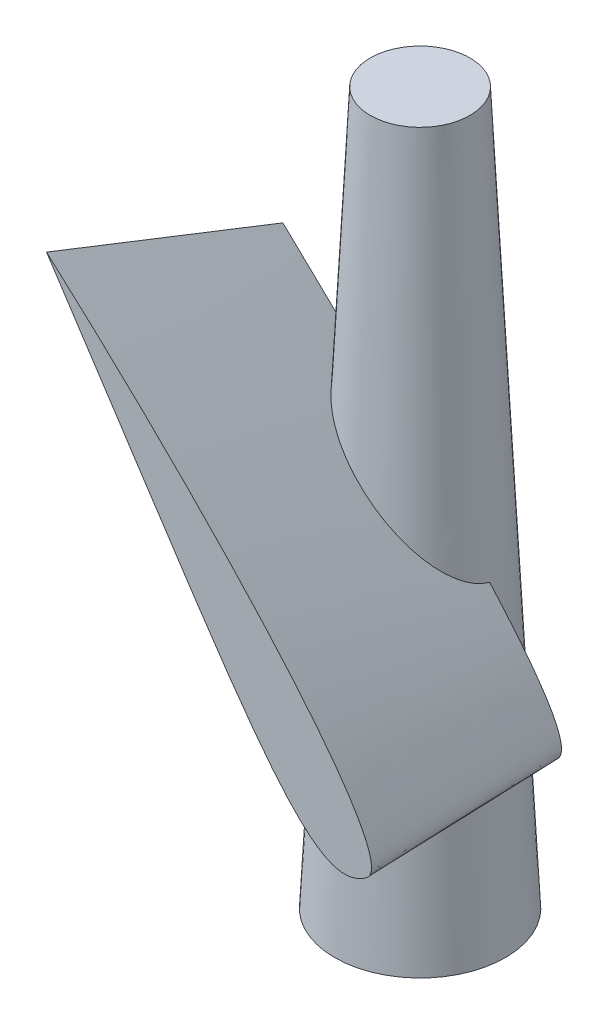
ISO-10303-21;
HEADER;
FILE_DESCRIPTION(('STEP AP214'),'2;1');
FILE_NAME('part.step','',(''),(''),'','','');
FILE_SCHEMA(('AUTOMOTIVE_DESIGN { 1 0 10303 214 1 1 1 1 }'));
ENDSEC;
DATA;
#1=APPLICATION_CONTEXT('core data for automotive mechanical design processes');
#2=APPLICATION_PROTOCOL_DEFINITION('international standard','automotive_design',2000,#1);
#3=PRODUCT_CONTEXT('',#1,'mechanical');
#4=PRODUCT('Part','Part','',(#3));
#5=PRODUCT_RELATED_PRODUCT_CATEGORY('part','',(#4));
#6=PRODUCT_DEFINITION_FORMATION('','',#4);
#7=PRODUCT_DEFINITION_CONTEXT('part definition',#1,'design');
#8=PRODUCT_DEFINITION('design','',#6,#7);
#9=PRODUCT_DEFINITION_SHAPE('','',#8);
#10=(LENGTH_UNIT() NAMED_UNIT(*) SI_UNIT(.MILLI.,.METRE.));
#11=(NAMED_UNIT(*) PLANE_ANGLE_UNIT() SI_UNIT($,.RADIAN.));
#12=(NAMED_UNIT(*) SI_UNIT($,.STERADIAN.) SOLID_ANGLE_UNIT());
#13=UNCERTAINTY_MEASURE_WITH_UNIT(LENGTH_MEASURE(1.E-05),#10,'distance_accuracy_value','');
#14=(GEOMETRIC_REPRESENTATION_CONTEXT(3) GLOBAL_UNCERTAINTY_ASSIGNED_CONTEXT((#13)) GLOBAL_UNIT_ASSIGNED_CONTEXT((#10,
#11,#12)) REPRESENTATION_CONTEXT('',''));
#15=CARTESIAN_POINT('',(0.,0.,0.));
#16=DIRECTION('',(0.,0.,1.));
#17=DIRECTION('',(1.,0.,0.));
#18=AXIS2_PLACEMENT_3D('',#15,#16,#17);
#19=CARTESIAN_POINT('',(0.,49.1958826296176,0.));
#20=DIRECTION('',(0.,-1.,0.));
#21=DIRECTION('',(0.,0.,-1.));
#22=AXIS2_PLACEMENT_3D('',#19,#20,#21);
#23=PLANE('',#22);
#24=CARTESIAN_POINT('',(0.,49.1958826296176,0.));
#25=DIRECTION('',(0.,1.,0.));
#26=DIRECTION('',(0.,0.,1.));
#27=AXIS2_PLACEMENT_3D('',#24,#25,#26);
#28=CIRCLE('',#27,7.);
#29=CARTESIAN_POINT('',(0.,49.1958826296176,7.));
#30=VERTEX_POINT('',#29);
#31=EDGE_CURVE('E226',#30,#30,#28,.T.);
#32=ORIENTED_EDGE('',*,*,#31,.T.);
#33=EDGE_LOOP('',(#32));
#34=FACE_BOUND('',#33,.T.);
#35=ADVANCED_FACE('F59',(#34),#23,.F.);
#36=CARTESIAN_POINT('',(0.,-50.8041173703824,0.));
#37=DIRECTION('',(0.,-1.,0.));
#38=DIRECTION('',(0.,0.,-1.));
#39=AXIS2_PLACEMENT_3D('',#36,#37,#38);
#40=CONICAL_SURFACE('',#39,12.,0.0499583957219429);
#41=DIRECTION('',(0.0499376169438924,0.998752338877845,0.));
#42=VECTOR('',#41,1.);
#43=CARTESIAN_POINT('',(0.,189.195882629617,0.));
#44=LINE('',#43,#42);
#45=CARTESIAN_POINT('',(-9.09974276166729,7.20102834815326,0.));
#46=VERTEX_POINT('',#45);
#47=CARTESIAN_POINT('',(-8.81399314004174,12.9160340652492,0.));
#48=VERTEX_POINT('',#47);
#49=EDGE_CURVE('E213',#46,#48,#44,.T.);
#50=ORIENTED_EDGE('',*,*,#49,.T.);
#51=CARTESIAN_POINT('',(-8.81373882291539,12.92110617131,0.));
#52=CARTESIAN_POINT('',(-8.81235105806115,12.9489855438266,0.122591007229465));
#53=CARTESIAN_POINT('',(-8.80850726549947,12.9745869774147,0.245680547855712));
#54=CARTESIAN_POINT('',(-8.79582673148377,13.0210779437967,0.49252900561061));
#55=CARTESIAN_POINT('',(-8.78698844378856,13.0419660145814,0.616288118274034));
#56=CARTESIAN_POINT('',(-8.76423807949435,13.0788579059762,0.864079340234062));
#57=CARTESIAN_POINT('',(-8.75032568713207,13.094861422505,0.988111466042806));
#58=CARTESIAN_POINT('',(-8.71743818551954,13.1218220524916,1.23572440358462));
#59=CARTESIAN_POINT('',(-8.6984762239414,13.1327920726238,1.35930555434819));
#60=CARTESIAN_POINT('',(-8.65548216782449,13.1496540556813,1.60591951041913));
#61=CARTESIAN_POINT('',(-8.63145067266379,13.1555466185031,1.72895237879629));
#62=CARTESIAN_POINT('',(-8.57837226945842,13.1622058942365,1.97405591564096));
#63=CARTESIAN_POINT('',(-8.54932566173171,13.1629729139698,2.09612664126664));
#64=CARTESIAN_POINT('',(-8.47045535884727,13.1584604998513,2.39996106518395));
#65=CARTESIAN_POINT('',(-8.41752653479017,13.1499483108053,2.5808900688344));
#66=CARTESIAN_POINT('',(-8.30101446105046,13.1214536001127,2.93837280668475));
#67=CARTESIAN_POINT('',(-8.23742922745373,13.1014689409419,3.11492571914489));
#68=CARTESIAN_POINT('',(-8.10029687000736,13.0503813266442,3.46239138227945));
#69=CARTESIAN_POINT('',(-8.02675303417487,13.0192820356868,3.63330597148488));
#70=CARTESIAN_POINT('',(-7.8704867390319,12.946475020804,3.9685356302295));
#71=CARTESIAN_POINT('',(-7.7877642715586,12.9047672874443,4.13285069389938));
#72=CARTESIAN_POINT('',(-7.61411351812843,12.8114311848407,4.45390067689366));
#73=CARTESIAN_POINT('',(-7.52319420023703,12.7598135896281,4.61064359912555));
#74=CARTESIAN_POINT('',(-7.3339488255341,12.6473246108628,4.91619577546954));
#75=CARTESIAN_POINT('',(-7.23562014876919,12.5864499461857,5.06500219116345));
#76=CARTESIAN_POINT('',(-7.03243851474794,12.4561849854445,5.35428385630897));
#77=CARTESIAN_POINT('',(-6.92758281411492,12.3867910965839,5.49475555347604));
#78=CARTESIAN_POINT('',(-6.71223183660292,12.24025813728,5.76708896957227));
#79=CARTESIAN_POINT('',(-6.6017353558126,12.1631174100028,5.89894883667538));
#80=CARTESIAN_POINT('',(-6.32123806852898,11.9627794987319,6.21568283409383));
#81=CARTESIAN_POINT('',(-6.1483199291039,11.8353606410771,6.39532958067268));
#82=CARTESIAN_POINT('',(-5.79415997775168,11.5673128120739,6.73556193381654));
#83=CARTESIAN_POINT('',(-5.61291501600888,11.4266788204101,6.89614024357872));
#84=CARTESIAN_POINT('',(-5.24379899763389,11.1339610255003,7.19893817043827));
#85=CARTESIAN_POINT('',(-5.0559174710569,10.9818586576657,7.3411269634686));
#86=CARTESIAN_POINT('',(-4.67547644703097,10.6681459091807,7.6075078225748));
#87=CARTESIAN_POINT('',(-4.48291686886355,10.5065353644007,7.73169957785894));
#88=CARTESIAN_POINT('',(-4.01582853262215,10.1082081635725,8.00966892941568));
#89=CARTESIAN_POINT('',(-3.73965813078891,9.86756005692279,8.1550857966826));
#90=CARTESIAN_POINT('',(-3.18367127312588,9.37370496922854,8.4141693024886));
#91=CARTESIAN_POINT('',(-2.90385344991939,9.12049317217573,8.52782365311591));
#92=CARTESIAN_POINT('',(-2.34257655993495,8.6039313734335,8.72550352958682));
#93=CARTESIAN_POINT('',(-2.06111602352973,8.34057049956718,8.80949624343522));
#94=CARTESIAN_POINT('',(-1.49864925261598,7.80615470770852,8.94949426236417));
#95=CARTESIAN_POINT('',(-1.21764301539961,7.53509983575635,9.00549973488048));
#96=CARTESIAN_POINT('',(-0.562905492641069,6.89450955602871,9.10554420090885));
#97=CARTESIAN_POINT('',(-0.189879499205135,6.52260451768454,9.13916943209965));
#98=CARTESIAN_POINT('',(0.550190917168877,5.77148178146754,9.16216800673546));
#99=CARTESIAN_POINT('',(0.917233327666796,5.39226171330141,9.15152675832972));
#100=CARTESIAN_POINT('',(1.64343470395045,4.62895530176814,9.08813144674388));
#101=CARTESIAN_POINT('',(2.00258331721707,4.24486350164744,9.03532511933745));
#102=CARTESIAN_POINT('',(2.7103960497074,3.47489522543202,8.88902051876411));
#103=CARTESIAN_POINT('',(3.0590614567604,3.08901897532681,8.79552726587541));
#104=CARTESIAN_POINT('',(3.74854930456497,2.31265774318157,8.56708990854071));
#105=CARTESIAN_POINT('',(4.0892008360501,1.92218137112964,8.43159991362729));
#106=CARTESIAN_POINT('',(4.75536032980021,1.14444986310791,8.11971811168111));
#107=CARTESIAN_POINT('',(5.08086511036231,0.757195417835146,7.943317757233));
#108=CARTESIAN_POINT('',(5.71329632429225,-0.0102139894655923,7.54942364569325));
#109=CARTESIAN_POINT('',(6.02025600814486,-0.390380758392269,7.33200650210983));
#110=CARTESIAN_POINT('',(6.61268910289461,-1.14050264242172,6.85466841769558));
#111=CARTESIAN_POINT('',(6.89817499895788,-1.51046361082972,6.59477245797882));
#112=CARTESIAN_POINT('',(7.33644445954181,-2.09336793271988,6.14103481288126));
#113=CARTESIAN_POINT('',(7.49743095035106,-2.31108919872387,5.96115708045263));
#114=CARTESIAN_POINT('',(7.80849250736739,-2.73953396162098,5.58435590937733));
#115=CARTESIAN_POINT('',(7.95856813024142,-2.95025781522013,5.38743334147402));
#116=CARTESIAN_POINT('',(8.24612489775082,-3.36279955456344,4.97608079539906));
#117=CARTESIAN_POINT('',(8.3836130041834,-3.56462233083352,4.76166062029828));
#118=CARTESIAN_POINT('',(8.64411098615675,-3.95722917513342,4.31467755845224));
#119=CARTESIAN_POINT('',(8.76712519645356,-4.14801653938788,4.08212013846455));
#120=CARTESIAN_POINT('',(8.96491374256791,-4.46542222955742,3.66466815892328));
#121=CARTESIAN_POINT('',(9.04367734476169,-4.5953139797098,3.48414447564302));
#122=CARTESIAN_POINT('',(9.19122150384477,-4.84651451477722,3.11325691363288));
#123=CARTESIAN_POINT('',(9.26000199321065,-4.96782324163585,2.92289296835759));
#124=CARTESIAN_POINT('',(9.38613298395013,-5.19996178103443,2.53310934542788));
#125=CARTESIAN_POINT('',(9.44352030132018,-5.310824717185,2.333721480171));
#126=CARTESIAN_POINT('',(9.54577413886662,-5.52077124761165,1.92582767034001));
#127=CARTESIAN_POINT('',(9.59064567036764,-5.61985954730787,1.71732541396394));
#128=CARTESIAN_POINT('',(9.67147085875204,-5.8166379598909,1.26375571743129));
#129=CARTESIAN_POINT('',(9.70547054406748,-5.9124236702405,1.01749015014767));
#130=CARTESIAN_POINT('',(9.74159228585994,-6.04103475733221,0.641094467951746));
#131=CARTESIAN_POINT('',(9.75115726879974,-6.08145792064529,0.514208600874014));
#132=CARTESIAN_POINT('',(9.76505799229478,-6.15688645722899,0.258480393397312));
#133=CARTESIAN_POINT('',(9.76939083108383,-6.19188881472935,0.12963700742116));
#134=CARTESIAN_POINT('',(9.7709945526111,-6.2240084226043,0.));
#135=B_SPLINE_CURVE_WITH_KNOTS('',3,(#51,#52,#53,#54,#55,#56,#57,#58,#59,#60,#61,#62,#63,#64,
#65,#66,#67,#68,#69,#70,#71,#72,#73,#74,#75,#76,#77,#78,#79,#80,#81,#82,#83,#84,#85,#86,#87,#88,
#89,#90,#91,#92,#93,#94,#95,#96,#97,#98,#99,#100,#101,#102,#103,#104,#105,#106,#107,#108,#109,
#110,#111,#112,#113,#114,#115,#116,#117,#118,#119,#120,#121,#122,#123,#124,#125,#126,#127,#128,
#129,#130,#131,#132,#133,#134),.UNSPECIFIED.,.F.,.F.,(4,2,2,2,2,2,2,2,2,2,2,2,2,2,2,2,2,2,2,2,2,
2,2,2,2,2,2,2,2,2,2,2,2,2,2,2,2,2,2,2,2,4),(0.,0.377153129030195,0.754423084570855,
1.13171652175835,1.50803703743511,1.88431308512042,2.26056660822936,2.82592809105076,
3.39139494492868,3.95667555260778,4.5219566630099,5.08662664321868,5.65149723656126,
6.21660687539208,6.78183763394427,7.6206197955002,8.45972190140754,9.30021274807087,
10.1407181074834,11.3213017242068,12.5023414410717,13.6846835731393,14.8670186316723,
16.4482896669063,18.030081988206,19.6138380132807,21.1973986772542,22.8024734387583,
24.4078838516701,26.0103247559028,27.611826658671,28.5864645289079,29.5610526386693,
30.5350984334905,31.508851766883,32.2161507934811,32.9234546038603,33.6284342310826,
34.3331311777001,35.1306773401247,35.5310155187342,35.9315756245311),.UNSPECIFIED.);
#136=CARTESIAN_POINT('',(9.77105482404436,-6.22521326584373,0.));
#137=VERTEX_POINT('',#136);
#138=EDGE_CURVE('E12',#48,#137,#135,.T.);
#139=ORIENTED_EDGE('',*,*,#138,.T.);
#140=DIRECTION('',(0.0499376169438924,-0.998752338877845,0.));
#141=VECTOR('',#140,1.);
#142=CARTESIAN_POINT('',(0.,189.195882629617,0.));
#143=LINE('',#142,#141);
#144=CARTESIAN_POINT('',(10.5046002131323,-20.8961752360425,0.));
#145=VERTEX_POINT('',#144);
#146=EDGE_CURVE('E68',#137,#145,#143,.T.);
#147=ORIENTED_EDGE('',*,*,#146,.T.);
#148=CARTESIAN_POINT('',(10.5048431859889,-20.9009810901597,0.));
#149=CARTESIAN_POINT('',(10.5037938108638,-20.879960550775,0.118851775335686));
#150=CARTESIAN_POINT('',(10.500619337688,-20.8568550687008,0.237292946091993));
#151=CARTESIAN_POINT('',(10.4901222180289,-20.8065664708305,0.473107527884032));
#152=CARTESIAN_POINT('',(10.4828000516358,-20.7793838272284,0.590481060900177));
#153=CARTESIAN_POINT('',(10.4547895765973,-20.6919306552072,0.940350799074532));
#154=CARTESIAN_POINT('',(10.4280538344412,-20.6256966123986,1.17092403070044));
#155=CARTESIAN_POINT('',(10.3598897720261,-20.4789511929175,1.62273054854236));
#156=CARTESIAN_POINT('',(10.3186019408632,-20.3985798924706,1.84403126222651));
#157=CARTESIAN_POINT('',(10.2225781893923,-20.2241258708836,2.27819340099424));
#158=CARTESIAN_POINT('',(10.16783892402,-20.1300397415503,2.4910527115791));
#159=CARTESIAN_POINT('',(10.0466006163165,-19.9297271022687,2.90622870398394));
#160=CARTESIAN_POINT('',(9.98015458776914,-19.8235560550556,3.10858780177981));
#161=CARTESIAN_POINT('',(9.83678087337357,-19.5998268163674,3.50297887689802));
#162=CARTESIAN_POINT('',(9.75985397146972,-19.4822694767497,3.69501162510983));
#163=CARTESIAN_POINT('',(9.59673581311245,-19.2365820513663,4.06872450701336));
#164=CARTESIAN_POINT('',(9.51052436107557,-19.1084290646394,4.25038070163734));
#165=CARTESIAN_POINT('',(9.33029448762727,-18.8428238182507,4.60271576273215));
#166=CARTESIAN_POINT('',(9.23627406155024,-18.7053691724196,4.77339179037147));
#167=CARTESIAN_POINT('',(8.98709319491903,-18.3428048831633,5.19637684485151));
#168=CARTESIAN_POINT('',(8.82719796478269,-18.1117424579737,5.44082970418012));
#169=CARTESIAN_POINT('',(8.49529736300334,-17.6330475972958,5.90394318070907));
#170=CARTESIAN_POINT('',(8.32328595899585,-17.3854069109589,6.12259080305212));
#171=CARTESIAN_POINT('',(7.96991713868284,-16.8763203414623,6.53595553068521));
#172=CARTESIAN_POINT('',(7.78854345901573,-16.6148504144762,6.73062885869772));
#173=CARTESIAN_POINT('',(7.41892663066821,-16.0812996377394,7.09745990149399));
#174=CARTESIAN_POINT('',(7.23068366340554,-15.8092190682026,7.26961821034933));
#175=CARTESIAN_POINT('',(6.88391449938525,-15.307042042691,7.56352949279466));
#176=CARTESIAN_POINT('',(6.72624624696826,-15.0783625049988,7.68874378784219));
#177=CARTESIAN_POINT('',(6.40819470040083,-14.6161247623764,7.92607080435274));
#178=CARTESIAN_POINT('',(6.2478110543366,-14.3825659241592,8.03818181252325));
#179=CARTESIAN_POINT('',(5.76339292792638,-13.6755411215971,8.35608919290886));
#180=CARTESIAN_POINT('',(5.43617967035144,-13.1958547234843,8.54338647341576));
#181=CARTESIAN_POINT('',(4.7758800434147,-12.2238844934961,8.87422429717491));
#182=CARTESIAN_POINT('',(4.44278052201229,-11.7315709233727,9.01764879791901));
#183=CARTESIAN_POINT('',(3.77325359795905,-10.7393244392548,9.26414446887962));
#184=CARTESIAN_POINT('',(3.43682658829874,-10.2393924213478,9.36722034744588));
#185=CARTESIAN_POINT('',(2.77924385808038,-9.26108707029671,9.53136161891825));
#186=CARTESIAN_POINT('',(2.45820718346704,-8.7829498330631,9.59433830242864));
#187=CARTESIAN_POINT('',(1.81475964257059,-7.8242094690315,9.68783301043263));
#188=CARTESIAN_POINT('',(1.49234834444185,-7.34360555589513,9.71833994297196));
#189=CARTESIAN_POINT('',(0.846715960320041,-6.38170158203066,9.74748329554645));
#190=CARTESIAN_POINT('',(0.523494598624048,-5.90040131784613,9.74610676681477));
#191=CARTESIAN_POINT('',(-0.122395782055687,-4.94010702067068,9.71137321518211));
#192=CARTESIAN_POINT('',(-0.445064453614588,-4.46111024385963,9.67808648932441));
#193=CARTESIAN_POINT('',(-1.0898037145691,-3.50636306697959,9.57880403842114));
#194=CARTESIAN_POINT('',(-1.41187448713494,-3.03061148198628,9.51282098033382));
#195=CARTESIAN_POINT('',(-2.05443537506334,-2.08440024561802,9.34661474587973));
#196=CARTESIAN_POINT('',(-2.37492635490723,-1.61393746313418,9.24641306472516));
#197=CARTESIAN_POINT('',(-2.93212342670146,-0.799296058199094,9.03947879196342));
#198=CARTESIAN_POINT('',(-3.1694057107914,-0.453434105941406,8.94089026735099));
#199=CARTESIAN_POINT('',(-3.6419276796046,0.232770247361135,8.72190017326419));
#200=CARTESIAN_POINT('',(-3.8771674550654,0.573112894187577,8.60149957803084));
#201=CARTESIAN_POINT('',(-4.3447388694845,1.24649675233879,8.33711687507153));
#202=CARTESIAN_POINT('',(-4.57707109325341,1.57953944240704,8.1931395942495));
#203=CARTESIAN_POINT('',(-5.03773236499062,2.23608791358334,7.87931392612985));
#204=CARTESIAN_POINT('',(-5.26606221813048,2.55959562201317,7.70947081053803));
#205=CARTESIAN_POINT('',(-5.66579403358683,3.12176717313831,7.38296201363721));
#206=CARTESIAN_POINT('',(-5.83832843482056,3.36298791024986,7.23209049106127));
#207=CARTESIAN_POINT('',(-6.17906308731009,3.83598271586189,6.91154864383013));
#208=CARTESIAN_POINT('',(-6.34726269378745,4.06775538195917,6.74187554220259));
#209=CARTESIAN_POINT('',(-6.6776039829798,4.51885036481688,6.38224302509603));
#210=CARTESIAN_POINT('',(-6.83975519469533,4.73819257528391,6.19231751120261));
#211=CARTESIAN_POINT('',(-7.15629487726873,5.16133586000876,5.79004051735663));
#212=CARTESIAN_POINT('',(-7.3106881427582,5.36514657443563,5.57770314658578));
#213=CARTESIAN_POINT('',(-7.54887816764328,5.6745279035114,5.21924118635974));
#214=CARTESIAN_POINT('',(-7.636047075948,5.78658443016339,5.08092494663294));
#215=CARTESIAN_POINT('',(-7.80595504578177,6.00234741588837,4.79524152323819));
#216=CARTESIAN_POINT('',(-7.88869327211558,6.10605230249859,4.64787264428664));
#217=CARTESIAN_POINT('',(-8.04875301339695,6.30355790169683,4.34407655934673));
#218=CARTESIAN_POINT('',(-8.12608013296841,6.39736891465964,4.18765904189917));
#219=CARTESIAN_POINT('',(-8.27435477412203,6.5735599024033,3.86570697202688));
#220=CARTESIAN_POINT('',(-8.34530605522979,6.65594662931099,3.70017788635771));
#221=CARTESIAN_POINT('',(-8.46781136572157,6.79415514915949,3.39039140343755));
#222=CARTESIAN_POINT('',(-8.52057529496916,6.85209757701592,3.24755856665663));
#223=CARTESIAN_POINT('',(-8.62033163107931,6.95806753987771,2.95636500424867));
#224=CARTESIAN_POINT('',(-8.66732685985595,7.00609993053469,2.80800702805895));
#225=CARTESIAN_POINT('',(-8.75483828867789,7.09126408695793,2.50651915207624));
#226=CARTESIAN_POINT('',(-8.79536208836535,7.12840868216313,2.35339510567386));
#227=CARTESIAN_POINT('',(-8.86936092388323,7.1910209222663,2.04310633030866));
#228=CARTESIAN_POINT('',(-8.90283688602718,7.2164901022097,1.88594213540249));
#229=CARTESIAN_POINT('',(-8.95899191477626,7.25301658276754,1.58593104187066));
#230=CARTESIAN_POINT('',(-8.98244867265502,7.26533853674388,1.44338266278332));
#231=CARTESIAN_POINT('',(-9.02308655862067,7.27993835522063,1.15688055043691));
#232=CARTESIAN_POINT('',(-9.04026791216388,7.28221658059444,1.01292686785697));
#233=CARTESIAN_POINT('',(-9.06829093537803,7.27664219734058,0.723752841872217));
#234=CARTESIAN_POINT('',(-9.0790949150954,7.26873022236186,0.578530015903034));
#235=CARTESIAN_POINT('',(-9.09423687995394,7.24287398769744,0.288615025453907));
#236=CARTESIAN_POINT('',(-9.0985737873615,7.22492805654414,0.143922953430722));
#237=CARTESIAN_POINT('',(-9.09969078020566,7.20206702550444,0.));
#238=B_SPLINE_CURVE_WITH_KNOTS('',3,(#148,#149,#150,#151,#152,#153,#154,#155,#156,#157,#158,
#159,#160,#161,#162,#163,#164,#165,#166,#167,#168,#169,#170,#171,#172,#173,#174,#175,#176,#177,
#178,#179,#180,#181,#182,#183,#184,#185,#186,#187,#188,#189,#190,#191,#192,#193,#194,#195,#196,
#197,#198,#199,#200,#201,#202,#203,#204,#205,#206,#207,#208,#209,#210,#211,#212,#213,#214,#215,
#216,#217,#218,#219,#220,#221,#222,#223,#224,#225,#226,#227,#228,#229,#230,#231,#232,#233,#234,
#235,#236,#237),.UNSPECIFIED.,.F.,.F.,(4,2,2,2,2,2,2,2,2,2,2,2,2,2,2,2,2,2,2,2,2,2,2,2,2,2,2,2,
2,2,2,2,2,2,2,2,2,2,2,2,2,2,2,2,4),(0.,0.36202260491212,0.724003314717603,1.44696987183229,
2.1631397586468,2.879487921084,3.59267180447383,4.3058023726648,5.02051671754344,
5.73541510940728,6.85096086409599,7.96706600360297,9.08517985820848,10.2032642047898,
11.1169663607976,12.0307878526582,13.8589447577604,15.6918960994126,17.5246334870301,
19.2617483979079,20.9994565323376,22.7378704110928,24.4724634046865,26.2063849205463,
27.9392192313336,29.2312923657284,30.5233078036094,31.8150590544361,33.106547385401,
34.1041902439083,35.1019806500574,36.0981262704387,37.0936484750926,37.6879126172845,
38.2822883883389,38.8760391243414,39.4694374247034,39.9577440223308,40.4458107916723,
40.9333001228039,41.420725342036,41.855221355378,42.289701757055,42.7267248531309,
43.1638207706999),.UNSPECIFIED.);
#239=EDGE_CURVE('E109',#145,#46,#238,.T.);
#240=ORIENTED_EDGE('',*,*,#239,.T.);
#241=EDGE_LOOP('',(#50,#139,#147,#240));
#242=FACE_BOUND('',#241,.T.);
#243=ORIENTED_EDGE('',*,*,#31,.F.);
#244=EDGE_LOOP('',(#243));
#245=FACE_BOUND('',#244,.T.);
#246=CARTESIAN_POINT('',(0.,-50.8041173703824,0.));
#247=DIRECTION('',(0.,1.,0.));
#248=DIRECTION('',(0.,0.,1.));
#249=AXIS2_PLACEMENT_3D('',#246,#247,#248);
#250=CIRCLE('',#249,12.);
#251=CARTESIAN_POINT('',(0.,-50.8041173703824,12.));
#252=VERTEX_POINT('',#251);
#253=EDGE_CURVE('E224',#252,#252,#250,.T.);
#254=ORIENTED_EDGE('',*,*,#253,.T.);
#255=EDGE_LOOP('',(#254));
#256=FACE_BOUND('',#255,.T.);
#257=ADVANCED_FACE('F198',(#242,#245,#256),#40,.T.);
#258=CARTESIAN_POINT('',(12.,-50.8041173703824,0.));
#259=DIRECTION('',(0.,1.,0.));
#260=DIRECTION('',(0.,0.,1.));
#261=AXIS2_PLACEMENT_3D('',#258,#259,#260);
#262=PLANE('',#261);
#263=ORIENTED_EDGE('',*,*,#253,.F.);
#264=EDGE_LOOP('',(#263));
#265=FACE_BOUND('',#264,.T.);
#266=ADVANCED_FACE('F148',(#265),#262,.F.);
#267=CARTESIAN_POINT('',(12.0306357461405,-8.81536875729188,0.));
#268=DIRECTION('',(0.,0.,-1.));
#269=DIRECTION('',(-1.,0.,0.));
#270=AXIS2_PLACEMENT_3D('',#267,#268,#269);
#271=PLANE('',#270);
#272=ORIENTED_EDGE('',*,*,#146,.F.);
#273=CARTESIAN_POINT('',(19.2836282905961,-22.9813332935694,0.));
#274=CARTESIAN_POINT('',(22.9922978389008,-19.5694206808462,0.));
#275=CARTESIAN_POINT('',(9.08939748414054,-3.93822933859881,0.));
#276=CARTESIAN_POINT('',(-19.2836282905962,22.9813332935696,0.));
#277=B_SPLINE_CURVE_WITH_KNOTS('',3,(#273,#274,#275,#276),.UNSPECIFIED.,.F.,.F.,(4,4),(0.,1.),.UNSPECIFIED.);
#278=CARTESIAN_POINT('',(19.2836282905961,-22.9813332935694,0.));
#279=VERTEX_POINT('',#278);
#280=EDGE_CURVE('E114',#279,#137,#277,.T.);
#281=ORIENTED_EDGE('',*,*,#280,.F.);
#282=CARTESIAN_POINT('',(-19.2836282905961,22.9813332935695,0.));
#283=CARTESIAN_POINT('',(2.08281486674436,-9.50759019948277,0.));
#284=CARTESIAN_POINT('',(12.3199576157623,-29.8040733707578,0.));
#285=CARTESIAN_POINT('',(19.2836282905961,-22.9813332935694,0.));
#286=B_SPLINE_CURVE_WITH_KNOTS('',3,(#282,#283,#284,#285),.UNSPECIFIED.,.F.,.F.,(4,4),(0.,1.),.UNSPECIFIED.);
#287=EDGE_CURVE('E102',#145,#279,#286,.T.);
#288=ORIENTED_EDGE('',*,*,#287,.F.);
#289=EDGE_LOOP('',(#272,#281,#288));
#290=FACE_BOUND('',#289,.T.);
#291=ADVANCED_FACE('F127',(#290),#271,.T.);
#292=ORIENTED_EDGE('',*,*,#49,.F.);
#293=CARTESIAN_POINT('',(-19.2836282905961,22.9813332935695,0.));
#294=VERTEX_POINT('',#293);
#295=EDGE_CURVE('E76',#294,#46,#286,.T.);
#296=ORIENTED_EDGE('',*,*,#295,.F.);
#297=EDGE_CURVE('E62',#48,#294,#277,.T.);
#298=ORIENTED_EDGE('',*,*,#297,.F.);
#299=EDGE_LOOP('',(#292,#296,#298));
#300=FACE_BOUND('',#299,.T.);
#301=ADVANCED_FACE('F147',(#300),#271,.T.);
#302=CARTESIAN_POINT('',(19.2836282905961,-22.9813332935694,0.));
#303=CARTESIAN_POINT('',(22.4975663390287,-20.8115555091643,30.));
#304=CARTESIAN_POINT('',(19.4471466883038,-22.8308991617912,0.));
#305=CARTESIAN_POINT('',(22.7048942742057,-20.6555836498407,30.));
#306=CARTESIAN_POINT('',(19.6944830229247,-22.4902633830622,0.));
#307=CARTESIAN_POINT('',(23.0158420586922,-20.2618389403538,30.));
#308=CARTESIAN_POINT('',(19.8159781966199,-22.0876624749694,0.));
#309=CARTESIAN_POINT('',(23.1314667456434,-19.7949737921668,30.));
#310=CARTESIAN_POINT('',(19.8611092901076,-21.7565892693001,0.));
#311=CARTESIAN_POINT('',(23.1739154769716,-19.4087783202832,30.));
#312=CARTESIAN_POINT('',(19.8738934581697,-21.5739375807274,0.));
#313=CARTESIAN_POINT('',(23.1769082792575,-19.1934637503874,30.));
#314=CARTESIAN_POINT('',(19.8684305218044,-21.0367554015704,0.));
#315=CARTESIAN_POINT('',(23.1335261178838,-18.5593891163811,30.));
#316=CARTESIAN_POINT('',(19.755984250113,-20.4125741466598,0.));
#317=CARTESIAN_POINT('',(22.967229892064,-17.8340850301325,30.));
#318=CARTESIAN_POINT('',(19.4990986972736,-19.649113509432,0.));
#319=CARTESIAN_POINT('',(22.6585864727977,-16.9536080317953,30.));
#320=CARTESIAN_POINT('',(19.0728457437971,-18.59952626521,0.));
#321=CARTESIAN_POINT('',(22.1470043400996,-15.7383091399013,30.));
#322=CARTESIAN_POINT('',(18.4325049521238,-17.4062495085726,0.));
#323=CARTESIAN_POINT('',(21.4141919338358,-14.3421648825773,30.0000000000001));
#324=CARTESIAN_POINT('',(17.4496722843028,-15.8194491484451,0.));
#325=CARTESIAN_POINT('',(20.2738037363841,-12.4842847297678,30.));
#326=CARTESIAN_POINT('',(16.3503044866147,-14.2316356546181,0.));
#327=CARTESIAN_POINT('',(19.0179367631071,-10.6139967278755,30.));
#328=CARTESIAN_POINT('',(15.0329428284842,-12.4775455647759,0.));
#329=CARTESIAN_POINT('',(17.5094684624709,-8.54550820631419,30.));
#330=CARTESIAN_POINT('',(13.4662371141482,-10.5147017646681,0.));
#331=CARTESIAN_POINT('',(15.7219606484446,-6.22398021691955,30.));
#332=CARTESIAN_POINT('',(11.7096183668046,-8.42244544915924,0.));
#333=CARTESIAN_POINT('',(13.7128725004885,-3.74905375231921,30.));
#334=CARTESIAN_POINT('',(8.99798853762124,-5.33245250660855,0.));
#335=CARTESIAN_POINT('',(10.6146897731883,-0.0882777195131229,30.));
#336=CARTESIAN_POINT('',(6.15041788389129,-2.24163049197614,0.));
#337=CARTESIAN_POINT('',(7.34472271853783,3.56548156468885,30.));
#338=CARTESIAN_POINT('',(2.49644902345666,1.59879321909632,0.));
#339=CARTESIAN_POINT('',(3.1241163140678,8.08779973630273,30.0000000000001));
#340=CARTESIAN_POINT('',(-1.42826971839868,5.61384444925866,0.));
#341=CARTESIAN_POINT('',(-1.42332404472938,12.8035734875703,30.0000000000001));
#342=CARTESIAN_POINT('',(-8.85428037862854,13.0202930473556,0.));
#343=CARTESIAN_POINT('',(-10.0941261421888,21.4402425969286,30.));
#344=CARTESIAN_POINT('',(-14.9283503766322,18.8491629175131,0.));
#345=CARTESIAN_POINT('',(-17.2711816057651,28.147742334186,30.));
#346=CARTESIAN_POINT('',(-19.2836282905962,22.9813332935696,0.));
#347=CARTESIAN_POINT('',(-22.4975663390288,32.8115555091644,30.));
#348=B_SPLINE_SURFACE_WITH_KNOTS('',3,1,((#302,#303),(#304,#305),(#306,#307),(#308,#309),(#310,
#311),(#312,#313),(#314,#315),(#316,#317),(#318,#319),(#320,#321),(#322,#323),(#324,#325),(#326,
#327),(#328,#329),(#330,#331),(#332,#333),(#334,#335),(#336,#337),(#338,#339),(#340,#341),(#342,
#343),(#344,#345),(#346,#347)),.UNSPECIFIED.,.F.,.F.,.F.,(4,1,2,1,1,1,1,1,1,1,1,1,1,1,1,1,1,1,1,
4),(2,2),(0.,0.0108487564377545,0.0202702150699112,0.0271573890345935,0.0291843131440547,
0.0466278093144078,0.0581719876172168,0.0682453908315682,0.101828944177793,0.124214880724418,
0.159435012833765,0.196145009710038,0.231400550470129,0.282139906429324,0.32964005178743,
0.432277581939125,0.487482614693894,0.588675910992674,0.706630713851961,1.),(0.,1.),.UNSPECIFIED.);
#349=DIRECTION('',(-0.101281661320973,0.309782336232437,0.945397762446282));
#350=VECTOR('',#349,1.);
#351=CARTESIAN_POINT('',(-20.8905973148125,27.896444401367,15.));
#352=LINE('',#351,#350);
#353=CARTESIAN_POINT('',(-22.4975663390288,32.8115555091644,30.));
#354=VERTEX_POINT('',#353);
#355=EDGE_CURVE('E124',#294,#354,#352,.T.);
#356=CARTESIAN_POINT('',(22.4975663390287,-20.8115555091643,30.));
#357=CARTESIAN_POINT('',(27.6792890466742,-16.9133691672154,30.));
#358=CARTESIAN_POINT('',(2.08521300656417,10.8748830212267,30.));
#359=CARTESIAN_POINT('',(-22.4975663390288,32.8115555091644,30.));
#360=B_SPLINE_CURVE_WITH_KNOTS('',3,(#356,#357,#358,#359),.UNSPECIFIED.,.F.,.F.,(4,4),(0.,1.),.UNSPECIFIED.);
#361=CARTESIAN_POINT('',(22.4975663390287,-20.8115555091643,30.));
#362=VERTEX_POINT('',#361);
#363=EDGE_CURVE('E122',#362,#354,#360,.T.);
#364=DIRECTION('',(-0.106247346947164,-0.071729177595803,-0.991749175118446));
#365=VECTOR('',#364,1.);
#366=CARTESIAN_POINT('',(20.8905973148124,-21.8964444013669,15.));
#367=LINE('',#366,#365);
#368=EDGE_CURVE('E107',#362,#279,#367,.T.);
#369=ORIENTED_EDGE('',*,*,#138,.F.);
#370=ORIENTED_EDGE('',*,*,#297,.T.);
#371=ORIENTED_EDGE('',*,*,#355,.T.);
#372=ORIENTED_EDGE('',*,*,#363,.F.);
#373=ORIENTED_EDGE('',*,*,#368,.T.);
#374=ORIENTED_EDGE('',*,*,#280,.T.);
#375=EDGE_LOOP('',(#369,#370,#371,#372,#373,#374));
#376=FACE_BOUND('',#375,.T.);
#377=ADVANCED_FACE('F119',(#376),#348,.T.);
#378=CARTESIAN_POINT('',(-19.2836282905961,22.9813332935695,0.));
#379=CARTESIAN_POINT('',(-22.4975663390288,32.8115555091644,30.));
#380=CARTESIAN_POINT('',(-15.8787465198038,17.8040118957328,0.));
#381=CARTESIAN_POINT('',(-18.5438933617979,26.8365919982833,30.));
#382=CARTESIAN_POINT('',(-12.1875684295665,12.0499017665774,0.));
#383=CARTESIAN_POINT('',(-14.2180127975358,20.2214155260187,30.0000000000001));
#384=CARTESIAN_POINT('',(-6.05362691747102,2.42039350899481,0.));
#385=CARTESIAN_POINT('',(-6.99567474670679,9.1716024567643,30.));
#386=CARTESIAN_POINT('',(-2.83627352198749,-2.63216609018267,0.));
#387=CARTESIAN_POINT('',(-3.20475439593743,3.37529293180582,30.));
#388=CARTESIAN_POINT('',(0.887500505687517,-8.27139183696947,0.));
#389=CARTESIAN_POINT('',(1.17448944149769,-3.09525362506675,30.));
#390=CARTESIAN_POINT('',(2.49924170538972,-10.6597917585232,0.));
#391=CARTESIAN_POINT('',(3.06235150247405,-5.84019736575887,30.));
#392=CARTESIAN_POINT('',(4.54026920661409,-13.5853157758155,0.));
#393=CARTESIAN_POINT('',(5.44759780879639,-9.20417473762573,30.));
#394=CARTESIAN_POINT('',(5.95817024889794,-15.5195421700921,0.));
#395=CARTESIAN_POINT('',(7.09255114683734,-11.4366098271045,29.9999999999999));
#396=CARTESIAN_POINT('',(7.76950586234847,-17.8382649823948,0.));
#397=CARTESIAN_POINT('',(9.18159329858968,-14.122000118717,29.9999999999999));
#398=CARTESIAN_POINT('',(8.86103335540752,-19.1560964232948,0.));
#399=CARTESIAN_POINT('',(10.4377940342042,-15.6493519463537,30.));
#400=CARTESIAN_POINT('',(10.5987400784627,-21.0260328157025,0.));
#401=CARTESIAN_POINT('',(12.4217212401052,-17.8345340827827,30.));
#402=CARTESIAN_POINT('',(11.6936147205647,-22.0815513169734,0.));
#403=CARTESIAN_POINT('',(13.6705911762669,-19.0672251599168,30.));
#404=CARTESIAN_POINT('',(13.1283216140272,-23.1391236887842,0.));
#405=CARTESIAN_POINT('',(15.290023923101,-20.346195736034,30.));
#406=CARTESIAN_POINT('',(13.9046417658958,-23.6209447913908,0.));
#407=CARTESIAN_POINT('',(16.1647295805853,-20.931766054228,30.));
#408=CARTESIAN_POINT('',(14.8007613880529,-24.0145317846499,0.));
#409=CARTESIAN_POINT('',(17.1761075107521,-21.4441122609558,30.));
#410=CARTESIAN_POINT('',(15.4709468697388,-24.2185138014931,0.));
#411=CARTESIAN_POINT('',(17.9297880080801,-21.7282994915963,30.));
#412=CARTESIAN_POINT('',(16.0785249936006,-24.2999563864593,0.));
#413=CARTESIAN_POINT('',(18.6239095434119,-21.8824118487459,30.));
#414=CARTESIAN_POINT('',(16.8481804096403,-24.2994366187194,0.));
#415=CARTESIAN_POINT('',(19.5091748903471,-21.9742572764743,30.));
#416=CARTESIAN_POINT('',(17.4771449310102,-24.157261323613,0.));
#417=CARTESIAN_POINT('',(20.2488083866697,-21.8904190695316,30.));
#418=CARTESIAN_POINT('',(18.4201224766007,-23.7266226423512,0.));
#419=CARTESIAN_POINT('',(21.3969459895924,-21.5336743225966,30.));
#420=CARTESIAN_POINT('',(18.9045105881227,-23.3527784212066,0.));
#421=CARTESIAN_POINT('',(22.0071698823962,-21.1801880119635,30.));
#422=CARTESIAN_POINT('',(19.2836282905961,-22.9813332935694,0.));
#423=CARTESIAN_POINT('',(22.4975663390287,-20.8115555091643,30.));
#424=B_SPLINE_SURFACE_WITH_KNOTS('',3,1,((#378,#379),(#380,#381),(#382,#383),(#384,#385),(#386,
#387),(#388,#389),(#390,#391),(#392,#393),(#394,#395),(#396,#397),(#398,#399),(#400,#401),(#402,
#403),(#404,#405),(#406,#407),(#408,#409),(#410,#411),(#412,#413),(#414,#415),(#416,#417),(#418,
#419),(#420,#421),(#422,#423)),.UNSPECIFIED.,.F.,.F.,.F.,(4,1,1,1,1,1,1,1,1,1,1,1,1,1,1,1,1,1,1,
1,4),(2,2),(0.,0.293599184273488,0.323899386487299,0.540943165538925,0.577405608281819,
0.644084220921608,0.677459899575897,0.746400067271297,0.757707492941771,0.816848870107179,
0.827394131539143,0.87856863661321,0.888677802913213,0.911865196359768,0.921636062883918,
0.93502660375484,0.944820510487339,0.950676710895486,0.971484623846174,0.974878598490217,1.),
(0.,1.),.UNSPECIFIED.);
#425=CARTESIAN_POINT('',(-22.4975663390288,32.8115555091644,30.));
#426=CARTESIAN_POINT('',(5.87564013536157,-10.0672749726406,30.));
#427=CARTESIAN_POINT('',(14.7581152298204,-26.6293243655513,30.));
#428=CARTESIAN_POINT('',(22.4975663390287,-20.8115555091643,30.));
#429=B_SPLINE_CURVE_WITH_KNOTS('',3,(#425,#426,#427,#428),.UNSPECIFIED.,.F.,.F.,(4,4),(0.,1.),.UNSPECIFIED.);
#430=EDGE_CURVE('E227',#354,#362,#429,.T.);
#431=ORIENTED_EDGE('',*,*,#239,.F.);
#432=ORIENTED_EDGE('',*,*,#287,.T.);
#433=ORIENTED_EDGE('',*,*,#368,.F.);
#434=ORIENTED_EDGE('',*,*,#430,.F.);
#435=ORIENTED_EDGE('',*,*,#355,.F.);
#436=ORIENTED_EDGE('',*,*,#295,.T.);
#437=EDGE_LOOP('',(#431,#432,#433,#434,#435,#436));
#438=FACE_BOUND('',#437,.T.);
#439=ADVANCED_FACE('F105',(#438),#424,.T.);
#440=CARTESIAN_POINT('',(11.1616882699644,-0.764432304745741,30.));
#441=DIRECTION('',(0.,0.,-1.));
#442=DIRECTION('',(-1.,0.,0.));
#443=AXIS2_PLACEMENT_3D('',#440,#441,#442);
#444=PLANE('',#443);
#445=ORIENTED_EDGE('',*,*,#363,.T.);
#446=ORIENTED_EDGE('',*,*,#430,.T.);
#447=EDGE_LOOP('',(#445,#446));
#448=FACE_BOUND('',#447,.T.);
#449=ADVANCED_FACE('F274',(#448),#444,.F.);
#450=CLOSED_SHELL('',(#35,#257,#266,#291,#301,#377,#439,#449));
#451=MANIFOLD_SOLID_BREP('B2',#450);
#452=ADVANCED_BREP_SHAPE_REPRESENTATION('',(#18,#451),#14);
#453=SHAPE_DEFINITION_REPRESENTATION(#9,#452);
ENDSEC;
END-ISO-10303-21;
